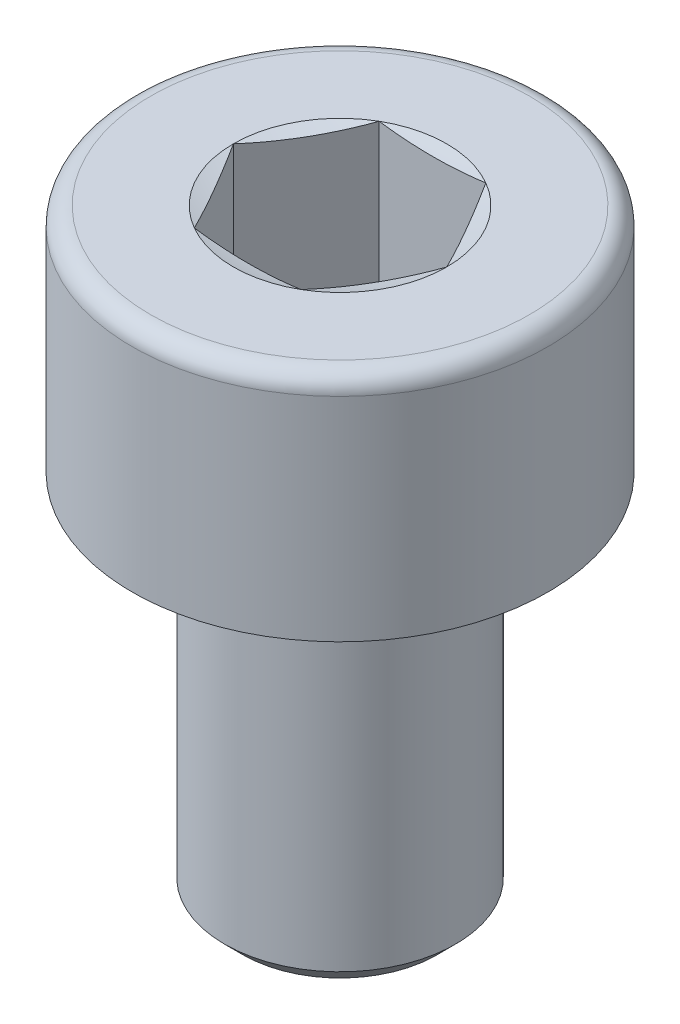
ISO-10303-21;
HEADER;
FILE_DESCRIPTION(('STEP AP214'),'2;1');
FILE_NAME('part.step','',(''),(''),'','','');
FILE_SCHEMA(('AUTOMOTIVE_DESIGN { 1 0 10303 214 1 1 1 1 }'));
ENDSEC;
DATA;
#1=APPLICATION_CONTEXT('core data for automotive mechanical design processes');
#2=APPLICATION_PROTOCOL_DEFINITION('international standard','automotive_design',2000,#1);
#3=PRODUCT_CONTEXT('',#1,'mechanical');
#4=PRODUCT('Part','Part','',(#3));
#5=PRODUCT_RELATED_PRODUCT_CATEGORY('part','',(#4));
#6=PRODUCT_DEFINITION_FORMATION('','',#4);
#7=PRODUCT_DEFINITION_CONTEXT('part definition',#1,'design');
#8=PRODUCT_DEFINITION('design','',#6,#7);
#9=PRODUCT_DEFINITION_SHAPE('','',#8);
#10=(LENGTH_UNIT() NAMED_UNIT(*) SI_UNIT(.MILLI.,.METRE.));
#11=(NAMED_UNIT(*) PLANE_ANGLE_UNIT() SI_UNIT($,.RADIAN.));
#12=(NAMED_UNIT(*) SI_UNIT($,.STERADIAN.) SOLID_ANGLE_UNIT());
#13=UNCERTAINTY_MEASURE_WITH_UNIT(LENGTH_MEASURE(1.E-05),#10,'distance_accuracy_value','');
#14=(GEOMETRIC_REPRESENTATION_CONTEXT(3) GLOBAL_UNCERTAINTY_ASSIGNED_CONTEXT((#13)) GLOBAL_UNIT_ASSIGNED_CONTEXT((#10,
#11,#12)) REPRESENTATION_CONTEXT('',''));
#15=CARTESIAN_POINT('',(0.,0.,0.));
#16=DIRECTION('',(0.,0.,1.));
#17=DIRECTION('',(1.,0.,0.));
#18=AXIS2_PLACEMENT_3D('',#15,#16,#17);
#19=CARTESIAN_POINT('',(-0.577350269189626,0.5,1.));
#20=DIRECTION('',(-0.866025403784439,0.,0.5));
#21=DIRECTION('',(0.5,0.,0.866025403784439));
#22=AXIS2_PLACEMENT_3D('',#19,#20,#21);
#23=PLANE('',#22);
#24=CARTESIAN_POINT('',(-0.577350269189626,2.5,1.));
#25=CARTESIAN_POINT('',(-0.602256905546369,2.4928156948734,0.956860440384478));
#26=CARTESIAN_POINT('',(-0.627233209396661,2.48665993251672,0.913600213130495));
#27=CARTESIAN_POINT('',(-0.677282869012062,2.47629629733561,0.826911659775093));
#28=CARTESIAN_POINT('',(-0.702356208114864,2.47208810385436,0.783483362533635));
#29=CARTESIAN_POINT('',(-0.777414647875531,2.46225168137474,0.653478331331313));
#30=CARTESIAN_POINT('',(-0.827492964204296,2.45934068378329,0.566740143092384));
#31=CARTESIAN_POINT('',(-0.923802752789168,2.46037348534467,0.399926695997169));
#32=CARTESIAN_POINT('',(-0.970035820593886,2.46381057241938,0.319848673569621));
#33=CARTESIAN_POINT('',(-1.03932177179707,2.47367744547349,0.199841885834972));
#34=CARTESIAN_POINT('',(-1.0624605054686,2.47776673103799,0.159764423493068));
#35=CARTESIAN_POINT('',(-1.10865304075022,2.48761182938245,0.0797566054548838));
#36=CARTESIAN_POINT('',(-1.13170682656885,2.49336793760975,0.0398262771102067));
#37=CARTESIAN_POINT('',(-1.15470053837925,2.5,0.));
#38=B_SPLINE_CURVE_WITH_KNOTS('',3,(#24,#25,#26,#27,#28,#29,#30,#31,#32,#33,#34,#35,#36,#37),
.UNSPECIFIED.,.F.,.F.,(4,2,2,2,2,2,4),(0.,0.150960283418929,0.3018957031821,0.602226966634645,
0.879613062899962,1.01895925678016,1.15833016516169),.UNSPECIFIED.);
#39=CARTESIAN_POINT('',(-0.577350269189627,2.5,0.999999999999998));
#40=VERTEX_POINT('',#39);
#41=CARTESIAN_POINT('',(-1.15470053837925,2.5,0.));
#42=VERTEX_POINT('',#41);
#43=EDGE_CURVE('E82',#40,#42,#38,.T.);
#44=ORIENTED_EDGE('',*,*,#43,.F.);
#45=DIRECTION('',(0.,1.,0.));
#46=VECTOR('',#45,1.);
#47=CARTESIAN_POINT('',(-0.577350269189626,0.5,1.));
#48=LINE('',#47,#46);
#49=CARTESIAN_POINT('',(-0.577350269189626,0.5,1.));
#50=VERTEX_POINT('',#49);
#51=EDGE_CURVE('E118',#40,#50,#48,.F.);
#52=ORIENTED_EDGE('',*,*,#51,.T.);
#53=DIRECTION('',(0.5,0.,0.866025403784439));
#54=VECTOR('',#53,1.);
#55=CARTESIAN_POINT('',(-0.577350269189626,0.5,1.));
#56=LINE('',#55,#54);
#57=CARTESIAN_POINT('',(-1.15470053837925,0.5,0.));
#58=VERTEX_POINT('',#57);
#59=EDGE_CURVE('E91',#58,#50,#56,.T.);
#60=ORIENTED_EDGE('',*,*,#59,.F.);
#61=DIRECTION('',(0.,1.,0.));
#62=VECTOR('',#61,1.);
#63=CARTESIAN_POINT('',(-1.15470053837925,0.5,0.));
#64=LINE('',#63,#62);
#65=EDGE_CURVE('E90',#58,#42,#64,.T.);
#66=ORIENTED_EDGE('',*,*,#65,.T.);
#67=EDGE_LOOP('',(#44,#52,#60,#66));
#68=FACE_BOUND('',#67,.T.);
#69=ADVANCED_FACE('F17',(#68),#23,.F.);
#70=CARTESIAN_POINT('',(-1.15470053837925,0.5,0.));
#71=DIRECTION('',(-0.866025403784439,0.,-0.5));
#72=DIRECTION('',(-0.5,0.,0.866025403784439));
#73=AXIS2_PLACEMENT_3D('',#70,#71,#72);
#74=PLANE('',#73);
#75=CARTESIAN_POINT('',(-1.15470053837925,2.5,0.));
#76=CARTESIAN_POINT('',(-1.12979390202251,2.4928156948734,-0.0431395596155219));
#77=CARTESIAN_POINT('',(-1.10481759817222,2.48665993251672,-0.086399786869505));
#78=CARTESIAN_POINT('',(-1.05476793855682,2.47629629733561,-0.173088340224907));
#79=CARTESIAN_POINT('',(-1.02969459945401,2.47208810385436,-0.216516637466365));
#80=CARTESIAN_POINT('',(-0.954636159693347,2.46225168137474,-0.346521668668687));
#81=CARTESIAN_POINT('',(-0.904557843364582,2.45934068378329,-0.433259856907615));
#82=CARTESIAN_POINT('',(-0.80824805477971,2.46037348534467,-0.600073304002831));
#83=CARTESIAN_POINT('',(-0.762014986974992,2.46381057241938,-0.680151326430379));
#84=CARTESIAN_POINT('',(-0.69272903577181,2.47367744547349,-0.800158114165028));
#85=CARTESIAN_POINT('',(-0.669590302100274,2.47776673103799,-0.840235576506932));
#86=CARTESIAN_POINT('',(-0.623397766818654,2.48761182938245,-0.920243394545117));
#87=CARTESIAN_POINT('',(-0.600343981000024,2.49336793760975,-0.960173722889794));
#88=CARTESIAN_POINT('',(-0.577350269189626,2.5,-1.));
#89=B_SPLINE_CURVE_WITH_KNOTS('',3,(#75,#76,#77,#78,#79,#80,#81,#82,#83,#84,#85,#86,#87,#88),
.UNSPECIFIED.,.F.,.F.,(4,2,2,2,2,2,4),(0.,0.150960283418929,0.3018957031821,0.602226966634645,
0.879613062899962,1.01895925678016,1.15833016516169),.UNSPECIFIED.);
#90=CARTESIAN_POINT('',(-0.577350269189623,2.5,-1.));
#91=VERTEX_POINT('',#90);
#92=EDGE_CURVE('E97',#42,#91,#89,.T.);
#93=ORIENTED_EDGE('',*,*,#92,.F.);
#94=ORIENTED_EDGE('',*,*,#65,.F.);
#95=DIRECTION('',(0.5,0.,-0.866025403784439));
#96=VECTOR('',#95,1.);
#97=CARTESIAN_POINT('',(-1.15470053837925,0.5,0.));
#98=LINE('',#97,#96);
#99=CARTESIAN_POINT('',(-0.577350269189626,0.5,-1.));
#100=VERTEX_POINT('',#99);
#101=EDGE_CURVE('E229',#58,#100,#98,.T.);
#102=ORIENTED_EDGE('',*,*,#101,.T.);
#103=DIRECTION('',(0.,1.,0.));
#104=VECTOR('',#103,1.);
#105=CARTESIAN_POINT('',(-0.577350269189626,0.5,-1.));
#106=LINE('',#105,#104);
#107=EDGE_CURVE('E116',#100,#91,#106,.T.);
#108=ORIENTED_EDGE('',*,*,#107,.T.);
#109=EDGE_LOOP('',(#93,#94,#102,#108));
#110=FACE_BOUND('',#109,.T.);
#111=ADVANCED_FACE('F114',(#110),#74,.F.);
#112=CARTESIAN_POINT('',(0.577350269189626,0.5,1.));
#113=DIRECTION('',(0.,0.,1.));
#114=DIRECTION('',(1.,0.,0.));
#115=AXIS2_PLACEMENT_3D('',#112,#113,#114);
#116=PLANE('',#115);
#117=CARTESIAN_POINT('',(0.577350269189626,2.5,0.999999999999999));
#118=CARTESIAN_POINT('',(0.527536996476139,2.4928156948734,1.));
#119=CARTESIAN_POINT('',(0.477584388775556,2.48665993251672,1.));
#120=CARTESIAN_POINT('',(0.377485069544755,2.47629629733561,1.));
#121=CARTESIAN_POINT('',(0.327338391339149,2.47208810385436,1.));
#122=CARTESIAN_POINT('',(0.177221511817816,2.46225168137474,1.));
#123=CARTESIAN_POINT('',(0.0770648791602852,2.45934068378329,1.));
#124=CARTESIAN_POINT('',(-0.115554698009459,2.46037348534467,1.));
#125=CARTESIAN_POINT('',(-0.208020833618895,2.46381057241938,1.));
#126=CARTESIAN_POINT('',(-0.346592736025259,2.47367744547349,1.));
#127=CARTESIAN_POINT('',(-0.392870203368329,2.47776673103799,1.));
#128=CARTESIAN_POINT('',(-0.48525527393157,2.48761182938245,1.));
#129=CARTESIAN_POINT('',(-0.531362845568829,2.49336793760975,1.));
#130=CARTESIAN_POINT('',(-0.577350269189626,2.5,1.));
#131=B_SPLINE_CURVE_WITH_KNOTS('',3,(#117,#118,#119,#120,#121,#122,#123,#124,#125,#126,#127,
#128,#129,#130),.UNSPECIFIED.,.F.,.F.,(4,2,2,2,2,2,4),(0.,0.150960283418929,0.3018957031821,
0.602226966634646,0.879613062899963,1.01895925678016,1.15833016516169),.UNSPECIFIED.);
#132=CARTESIAN_POINT('',(0.577350269189623,2.5,1.));
#133=VERTEX_POINT('',#132);
#134=EDGE_CURVE('E76',#133,#40,#131,.T.);
#135=ORIENTED_EDGE('',*,*,#134,.F.);
#136=DIRECTION('',(0.,1.,0.));
#137=VECTOR('',#136,1.);
#138=CARTESIAN_POINT('',(0.577350269189626,0.5,1.));
#139=LINE('',#138,#137);
#140=CARTESIAN_POINT('',(0.577350269189626,0.5,1.));
#141=VERTEX_POINT('',#140);
#142=EDGE_CURVE('E212',#133,#141,#139,.F.);
#143=ORIENTED_EDGE('',*,*,#142,.T.);
#144=DIRECTION('',(1.,0.,0.));
#145=VECTOR('',#144,1.);
#146=CARTESIAN_POINT('',(-0.577350269189626,0.5,1.));
#147=LINE('',#146,#145);
#148=EDGE_CURVE('E233',#141,#50,#147,.F.);
#149=ORIENTED_EDGE('',*,*,#148,.T.);
#150=ORIENTED_EDGE('',*,*,#51,.F.);
#151=EDGE_LOOP('',(#135,#143,#149,#150));
#152=FACE_BOUND('',#151,.T.);
#153=ADVANCED_FACE('F139',(#152),#116,.F.);
#154=CARTESIAN_POINT('',(-0.577350269189626,0.5,-1.));
#155=DIRECTION('',(0.,-1.,0.));
#156=DIRECTION('',(0.,0.,-1.));
#157=AXIS2_PLACEMENT_3D('',#154,#155,#156);
#158=PLANE('',#157);
#159=ORIENTED_EDGE('',*,*,#59,.T.);
#160=ORIENTED_EDGE('',*,*,#148,.F.);
#161=DIRECTION('',(0.5,0.,-0.866025403784438));
#162=VECTOR('',#161,1.);
#163=CARTESIAN_POINT('',(1.15470053837925,0.5,0.));
#164=LINE('',#163,#162);
#165=CARTESIAN_POINT('',(1.15470053837925,0.5,0.));
#166=VERTEX_POINT('',#165);
#167=EDGE_CURVE('E161',#141,#166,#164,.T.);
#168=ORIENTED_EDGE('',*,*,#167,.T.);
#169=DIRECTION('',(-0.5,0.,-0.866025403784439));
#170=VECTOR('',#169,1.);
#171=CARTESIAN_POINT('',(0.577350269189626,0.5,-1.));
#172=LINE('',#171,#170);
#173=CARTESIAN_POINT('',(0.577350269189626,0.5,-1.));
#174=VERTEX_POINT('',#173);
#175=EDGE_CURVE('E209',#166,#174,#172,.T.);
#176=ORIENTED_EDGE('',*,*,#175,.T.);
#177=DIRECTION('',(-1.,0.,0.));
#178=VECTOR('',#177,1.);
#179=CARTESIAN_POINT('',(-0.577350269189626,0.5,-1.));
#180=LINE('',#179,#178);
#181=EDGE_CURVE('E224',#174,#100,#180,.T.);
#182=ORIENTED_EDGE('',*,*,#181,.T.);
#183=ORIENTED_EDGE('',*,*,#101,.F.);
#184=EDGE_LOOP('',(#159,#160,#168,#176,#182,#183));
#185=FACE_BOUND('',#184,.T.);
#186=ADVANCED_FACE('F143',(#185),#158,.F.);
#187=CARTESIAN_POINT('',(-0.577350269189626,0.5,-1.));
#188=DIRECTION('',(0.,0.,-1.));
#189=DIRECTION('',(-1.,0.,0.));
#190=AXIS2_PLACEMENT_3D('',#187,#188,#189);
#191=PLANE('',#190);
#192=CARTESIAN_POINT('',(-0.577350269189626,2.5,-1.));
#193=CARTESIAN_POINT('',(-0.527536996476139,2.4928156948734,-1.));
#194=CARTESIAN_POINT('',(-0.477584388775556,2.48665993251672,-1.));
#195=CARTESIAN_POINT('',(-0.377485069544755,2.47629629733561,-1.));
#196=CARTESIAN_POINT('',(-0.327338391339149,2.47208810385436,-1.));
#197=CARTESIAN_POINT('',(-0.177221511817816,2.46225168137474,-1.));
#198=CARTESIAN_POINT('',(-0.077064879160285,2.45934068378329,-1.));
#199=CARTESIAN_POINT('',(0.11555469800946,2.46037348534467,-1.));
#200=CARTESIAN_POINT('',(0.208020833618896,2.46381057241938,-1.));
#201=CARTESIAN_POINT('',(0.34659273602526,2.47367744547349,-1.));
#202=CARTESIAN_POINT('',(0.39287020336833,2.47776673103799,-1.));
#203=CARTESIAN_POINT('',(0.485255273931571,2.48761182938245,-1.));
#204=CARTESIAN_POINT('',(0.53136284556883,2.49336793760975,-1.));
#205=CARTESIAN_POINT('',(0.577350269189627,2.5,-0.999999999999999));
#206=B_SPLINE_CURVE_WITH_KNOTS('',3,(#192,#193,#194,#195,#196,#197,#198,#199,#200,#201,#202,
#203,#204,#205),.UNSPECIFIED.,.F.,.F.,(4,2,2,2,2,2,4),(0.,0.150960283418929,0.3018957031821,
0.602226966634646,0.879613062899963,1.01895925678016,1.15833016516169),.UNSPECIFIED.);
#207=CARTESIAN_POINT('',(0.577350269189626,2.5,-0.999999999999999));
#208=VERTEX_POINT('',#207);
#209=EDGE_CURVE('E156',#91,#208,#206,.T.);
#210=ORIENTED_EDGE('',*,*,#209,.F.);
#211=ORIENTED_EDGE('',*,*,#107,.F.);
#212=ORIENTED_EDGE('',*,*,#181,.F.);
#213=DIRECTION('',(0.,1.,0.));
#214=VECTOR('',#213,1.);
#215=CARTESIAN_POINT('',(0.577350269189626,0.5,-1.));
#216=LINE('',#215,#214);
#217=EDGE_CURVE('E204',#174,#208,#216,.T.);
#218=ORIENTED_EDGE('',*,*,#217,.T.);
#219=EDGE_LOOP('',(#210,#211,#212,#218));
#220=FACE_BOUND('',#219,.T.);
#221=ADVANCED_FACE('F147',(#220),#191,.F.);
#222=CARTESIAN_POINT('',(1.15470053837925,0.5,0.));
#223=DIRECTION('',(0.866025403784438,0.,0.5));
#224=DIRECTION('',(0.5,0.,-0.866025403784438));
#225=AXIS2_PLACEMENT_3D('',#222,#223,#224);
#226=PLANE('',#225);
#227=CARTESIAN_POINT('',(1.15470053837925,2.5,0.));
#228=CARTESIAN_POINT('',(1.12979390202251,2.4928156948734,0.0431395596155222));
#229=CARTESIAN_POINT('',(1.10481759817222,2.48665993251672,0.0863997868695053));
#230=CARTESIAN_POINT('',(1.05476793855682,2.47629629733561,0.173088340224907));
#231=CARTESIAN_POINT('',(1.02969459945401,2.47208810385436,0.216516637466365));
#232=CARTESIAN_POINT('',(0.954636159693347,2.46225168137474,0.346521668668687));
#233=CARTESIAN_POINT('',(0.904557843364581,2.45934068378329,0.433259856907615));
#234=CARTESIAN_POINT('',(0.808248054779709,2.46037348534467,0.600073304002831));
#235=CARTESIAN_POINT('',(0.762014986974991,2.46381057241938,0.680151326430379));
#236=CARTESIAN_POINT('',(0.692729035771809,2.47367744547349,0.800158114165028));
#237=CARTESIAN_POINT('',(0.669590302100274,2.47776673103799,0.840235576506932));
#238=CARTESIAN_POINT('',(0.623397766818654,2.48761182938245,0.920243394545116));
#239=CARTESIAN_POINT('',(0.600343981000025,2.49336793760975,0.960173722889793));
#240=CARTESIAN_POINT('',(0.577350269189626,2.5,0.999999999999999));
#241=B_SPLINE_CURVE_WITH_KNOTS('',3,(#227,#228,#229,#230,#231,#232,#233,#234,#235,#236,#237,
#238,#239,#240),.UNSPECIFIED.,.F.,.F.,(4,2,2,2,2,2,4),(0.,0.150960283418929,0.3018957031821,
0.602226966634646,0.879613062899962,1.01895925678016,1.15833016516169),.UNSPECIFIED.);
#242=CARTESIAN_POINT('',(1.15470053837925,2.5,0.));
#243=VERTEX_POINT('',#242);
#244=EDGE_CURVE('E162',#243,#133,#241,.T.);
#245=ORIENTED_EDGE('',*,*,#244,.F.);
#246=DIRECTION('',(0.,1.,0.));
#247=VECTOR('',#246,1.);
#248=CARTESIAN_POINT('',(1.15470053837925,0.5,0.));
#249=LINE('',#248,#247);
#250=EDGE_CURVE('E200',#243,#166,#249,.F.);
#251=ORIENTED_EDGE('',*,*,#250,.T.);
#252=ORIENTED_EDGE('',*,*,#167,.F.);
#253=ORIENTED_EDGE('',*,*,#142,.F.);
#254=EDGE_LOOP('',(#245,#251,#252,#253));
#255=FACE_BOUND('',#254,.T.);
#256=ADVANCED_FACE('F152',(#255),#226,.F.);
#257=CARTESIAN_POINT('',(0.577350269189626,0.5,-1.));
#258=DIRECTION('',(0.866025403784439,0.,-0.5));
#259=DIRECTION('',(-0.5,0.,-0.866025403784439));
#260=AXIS2_PLACEMENT_3D('',#257,#258,#259);
#261=PLANE('',#260);
#262=CARTESIAN_POINT('',(1.15470053837925,2.5,0.));
#263=CARTESIAN_POINT('',(1.12979390202251,2.4928156948734,-0.0431395596155219));
#264=CARTESIAN_POINT('',(1.10481759817222,2.48665993251672,-0.0863997868695049));
#265=CARTESIAN_POINT('',(1.05476793855682,2.47629629733561,-0.173088340224907));
#266=CARTESIAN_POINT('',(1.02969459945401,2.47208810385436,-0.216516637466365));
#267=CARTESIAN_POINT('',(0.954636159693347,2.46225168137474,-0.346521668668687));
#268=CARTESIAN_POINT('',(0.904557843364582,2.45934068378329,-0.433259856907615));
#269=CARTESIAN_POINT('',(0.80824805477971,2.46037348534467,-0.600073304002831));
#270=CARTESIAN_POINT('',(0.762014986974991,2.46381057241938,-0.680151326430379));
#271=CARTESIAN_POINT('',(0.69272903577181,2.47367744547349,-0.800158114165028));
#272=CARTESIAN_POINT('',(0.669590302100275,2.47776673103799,-0.840235576506931));
#273=CARTESIAN_POINT('',(0.623397766818654,2.48761182938245,-0.920243394545116));
#274=CARTESIAN_POINT('',(0.600343981000025,2.49336793760975,-0.960173722889793));
#275=CARTESIAN_POINT('',(0.577350269189627,2.5,-0.999999999999999));
#276=B_SPLINE_CURVE_WITH_KNOTS('',3,(#262,#263,#264,#265,#266,#267,#268,#269,#270,#271,#272,
#273,#274,#275),.UNSPECIFIED.,.F.,.F.,(4,2,2,2,2,2,4),(0.,0.150960283418929,0.3018957031821,
0.602226966634645,0.879613062899962,1.01895925678016,1.15833016516169),.UNSPECIFIED.);
#277=EDGE_CURVE('E203',#243,#208,#276,.T.);
#278=ORIENTED_EDGE('',*,*,#277,.T.);
#279=ORIENTED_EDGE('',*,*,#217,.F.);
#280=ORIENTED_EDGE('',*,*,#175,.F.);
#281=ORIENTED_EDGE('',*,*,#250,.F.);
#282=EDGE_LOOP('',(#278,#279,#280,#281));
#283=FACE_BOUND('',#282,.T.);
#284=ADVANCED_FACE('F266',(#283),#261,.F.);
#285=CARTESIAN_POINT('',(0.,-4.,0.));
#286=DIRECTION('',(0.,-1.,0.));
#287=DIRECTION('',(0.,0.,-1.));
#288=AXIS2_PLACEMENT_3D('',#285,#286,#287);
#289=PLANE('',#288);
#290=CARTESIAN_POINT('',(0.,-3.99999999996226,0.));
#291=DIRECTION('',(0.,1.,0.));
#292=DIRECTION('',(0.,0.,1.));
#293=AXIS2_PLACEMENT_3D('',#290,#291,#292);
#294=CIRCLE('',#293,1.05000000002065);
#295=CARTESIAN_POINT('',(0.,-3.99999999996226,1.05000000002065));
#296=VERTEX_POINT('',#295);
#297=EDGE_CURVE('E260',#296,#296,#294,.T.);
#298=ORIENTED_EDGE('',*,*,#297,.F.);
#299=EDGE_LOOP('',(#298));
#300=FACE_BOUND('',#299,.T.);
#301=ADVANCED_FACE('F196',(#300),#289,.T.);
#302=CARTESIAN_POINT('',(-0.323386652483568,5.38251924939228,0.));
#303=DIRECTION('',(0.,0.,1.));
#304=DIRECTION('',(-1.,0.,0.));
#305=AXIS2_PLACEMENT_3D('',#302,#303,#304);
#306=CIRCLE('',#305,3.);
#307=TRIMMED_CURVE('',#306,(PARAMETER_VALUE(-1.67880173874616)),
(PARAMETER_VALUE(1.67880173874616)),.T.,.PARAMETER.);
#308=CARTESIAN_POINT('',(0.,5.38251924939228,0.));
#309=DIRECTION('',(0.,1.,0.));
#310=AXIS1_PLACEMENT('',#308,#309);
#311=SURFACE_OF_REVOLUTION('',#307,#310);
#312=ORIENTED_EDGE('',*,*,#244,.T.);
#313=CARTESIAN_POINT('',(0.,2.5,0.));
#314=DIRECTION('',(0.,1.,0.));
#315=DIRECTION('',(-1.,0.,0.));
#316=AXIS2_PLACEMENT_3D('',#313,#314,#315);
#317=CIRCLE('',#316,1.15470053837925);
#318=EDGE_CURVE('E258',#243,#133,#317,.F.);
#319=ORIENTED_EDGE('',*,*,#318,.F.);
#320=EDGE_LOOP('',(#312,#319));
#321=FACE_BOUND('',#320,.T.);
#322=ADVANCED_FACE('F192',(#321),#311,.T.);
#323=CARTESIAN_POINT('',(-0.323386652483568,5.38251924939228,0.));
#324=DIRECTION('',(0.,0.,1.));
#325=DIRECTION('',(-1.,0.,0.));
#326=AXIS2_PLACEMENT_3D('',#323,#324,#325);
#327=CIRCLE('',#326,3.);
#328=TRIMMED_CURVE('',#327,(PARAMETER_VALUE(-1.67880173874616)),
(PARAMETER_VALUE(1.67880173874616)),.T.,.PARAMETER.);
#329=CARTESIAN_POINT('',(0.,5.38251924939228,0.));
#330=DIRECTION('',(0.,1.,0.));
#331=AXIS1_PLACEMENT('',#329,#330);
#332=SURFACE_OF_REVOLUTION('',#328,#331);
#333=ORIENTED_EDGE('',*,*,#134,.T.);
#334=CARTESIAN_POINT('',(0.,2.5,0.));
#335=DIRECTION('',(0.,1.,0.));
#336=DIRECTION('',(-1.,0.,0.));
#337=AXIS2_PLACEMENT_3D('',#334,#335,#336);
#338=CIRCLE('',#337,1.15470053837925);
#339=EDGE_CURVE('E107',#133,#40,#338,.F.);
#340=ORIENTED_EDGE('',*,*,#339,.F.);
#341=EDGE_LOOP('',(#333,#340));
#342=FACE_BOUND('',#341,.T.);
#343=ADVANCED_FACE('F189',(#342),#332,.T.);
#344=CARTESIAN_POINT('',(-0.323386652483568,5.38251924939228,0.));
#345=DIRECTION('',(0.,0.,1.));
#346=DIRECTION('',(-1.,0.,0.));
#347=AXIS2_PLACEMENT_3D('',#344,#345,#346);
#348=CIRCLE('',#347,3.);
#349=TRIMMED_CURVE('',#348,(PARAMETER_VALUE(-1.67880173874616)),
(PARAMETER_VALUE(1.67880173874616)),.T.,.PARAMETER.);
#350=CARTESIAN_POINT('',(0.,5.38251924939228,0.));
#351=DIRECTION('',(0.,1.,0.));
#352=AXIS1_PLACEMENT('',#350,#351);
#353=SURFACE_OF_REVOLUTION('',#349,#352);
#354=ORIENTED_EDGE('',*,*,#43,.T.);
#355=CARTESIAN_POINT('',(0.,2.5,0.));
#356=DIRECTION('',(0.,1.,0.));
#357=DIRECTION('',(-1.,0.,0.));
#358=AXIS2_PLACEMENT_3D('',#355,#356,#357);
#359=CIRCLE('',#358,1.15470053837925);
#360=EDGE_CURVE('E86',#40,#42,#359,.F.);
#361=ORIENTED_EDGE('',*,*,#360,.F.);
#362=EDGE_LOOP('',(#354,#361));
#363=FACE_BOUND('',#362,.T.);
#364=ADVANCED_FACE('F84',(#363),#353,.T.);
#365=CARTESIAN_POINT('',(-0.323386652483568,5.38251924939228,0.));
#366=DIRECTION('',(0.,0.,1.));
#367=DIRECTION('',(-1.,0.,0.));
#368=AXIS2_PLACEMENT_3D('',#365,#366,#367);
#369=CIRCLE('',#368,3.);
#370=TRIMMED_CURVE('',#369,(PARAMETER_VALUE(-1.67880173874616)),
(PARAMETER_VALUE(1.67880173874616)),.T.,.PARAMETER.);
#371=CARTESIAN_POINT('',(0.,5.38251924939228,0.));
#372=DIRECTION('',(0.,1.,0.));
#373=AXIS1_PLACEMENT('',#371,#372);
#374=SURFACE_OF_REVOLUTION('',#370,#373);
#375=ORIENTED_EDGE('',*,*,#92,.T.);
#376=CARTESIAN_POINT('',(0.,2.5,0.));
#377=DIRECTION('',(0.,1.,0.));
#378=DIRECTION('',(-1.,0.,0.));
#379=AXIS2_PLACEMENT_3D('',#376,#377,#378);
#380=CIRCLE('',#379,1.15470053837925);
#381=EDGE_CURVE('E104',#42,#91,#380,.F.);
#382=ORIENTED_EDGE('',*,*,#381,.F.);
#383=EDGE_LOOP('',(#375,#382));
#384=FACE_BOUND('',#383,.T.);
#385=ADVANCED_FACE('F110',(#384),#374,.T.);
#386=CARTESIAN_POINT('',(-0.323386652483568,5.38251924939228,0.));
#387=DIRECTION('',(0.,0.,1.));
#388=DIRECTION('',(-1.,0.,0.));
#389=AXIS2_PLACEMENT_3D('',#386,#387,#388);
#390=CIRCLE('',#389,3.);
#391=TRIMMED_CURVE('',#390,(PARAMETER_VALUE(-1.67880173874616)),
(PARAMETER_VALUE(1.67880173874616)),.T.,.PARAMETER.);
#392=CARTESIAN_POINT('',(0.,5.38251924939228,0.));
#393=DIRECTION('',(0.,1.,0.));
#394=AXIS1_PLACEMENT('',#392,#393);
#395=SURFACE_OF_REVOLUTION('',#391,#394);
#396=ORIENTED_EDGE('',*,*,#209,.T.);
#397=CARTESIAN_POINT('',(0.,2.5,0.));
#398=DIRECTION('',(0.,1.,0.));
#399=DIRECTION('',(-1.,0.,0.));
#400=AXIS2_PLACEMENT_3D('',#397,#398,#399);
#401=CIRCLE('',#400,1.15470053837925);
#402=EDGE_CURVE('E112',#91,#208,#401,.F.);
#403=ORIENTED_EDGE('',*,*,#402,.F.);
#404=EDGE_LOOP('',(#396,#403));
#405=FACE_BOUND('',#404,.T.);
#406=ADVANCED_FACE('F168',(#405),#395,.T.);
#407=CARTESIAN_POINT('',(-0.323386652483568,5.38251924939228,0.));
#408=DIRECTION('',(0.,0.,1.));
#409=DIRECTION('',(-1.,0.,0.));
#410=AXIS2_PLACEMENT_3D('',#407,#408,#409);
#411=CIRCLE('',#410,3.);
#412=TRIMMED_CURVE('',#411,(PARAMETER_VALUE(-1.67880173874616)),
(PARAMETER_VALUE(1.67880173874616)),.T.,.PARAMETER.);
#413=CARTESIAN_POINT('',(0.,5.38251924939228,0.));
#414=DIRECTION('',(0.,1.,0.));
#415=AXIS1_PLACEMENT('',#413,#414);
#416=SURFACE_OF_REVOLUTION('',#412,#415);
#417=ORIENTED_EDGE('',*,*,#277,.F.);
#418=CARTESIAN_POINT('',(0.,2.5,0.));
#419=DIRECTION('',(0.,1.,0.));
#420=DIRECTION('',(-1.,0.,0.));
#421=AXIS2_PLACEMENT_3D('',#418,#419,#420);
#422=CIRCLE('',#421,1.15470053837925);
#423=EDGE_CURVE('E252',#208,#243,#422,.F.);
#424=ORIENTED_EDGE('',*,*,#423,.F.);
#425=EDGE_LOOP('',(#417,#424));
#426=FACE_BOUND('',#425,.T.);
#427=ADVANCED_FACE('F173',(#426),#416,.T.);
#428=CARTESIAN_POINT('',(0.,-3.79999999995562,0.));
#429=DIRECTION('',(0.,1.,0.));
#430=DIRECTION('',(0.,0.,1.));
#431=AXIS2_PLACEMENT_3D('',#428,#429,#430);
#432=CONICAL_SURFACE('',#431,1.25000000002728,0.785398163397448);
#433=ORIENTED_EDGE('',*,*,#297,.T.);
#434=EDGE_LOOP('',(#433));
#435=FACE_BOUND('',#434,.T.);
#436=CARTESIAN_POINT('',(0.,-3.8,0.));
#437=DIRECTION('',(0.,1.,0.));
#438=DIRECTION('',(0.,0.,1.));
#439=AXIS2_PLACEMENT_3D('',#436,#437,#438);
#440=CIRCLE('',#439,1.25);
#441=CARTESIAN_POINT('',(0.,-3.8,1.25));
#442=VERTEX_POINT('',#441);
#443=EDGE_CURVE('E255',#442,#442,#440,.T.);
#444=ORIENTED_EDGE('',*,*,#443,.F.);
#445=EDGE_LOOP('',(#444));
#446=FACE_BOUND('',#445,.T.);
#447=ADVANCED_FACE('F312',(#435,#446),#432,.T.);
#448=CARTESIAN_POINT('',(0.,2.5,0.));
#449=DIRECTION('',(0.,1.,0.));
#450=DIRECTION('',(0.,0.,1.));
#451=AXIS2_PLACEMENT_3D('',#448,#449,#450);
#452=PLANE('',#451);
#453=CARTESIAN_POINT('',(0.,2.5,0.));
#454=DIRECTION('',(0.,-1.,0.));
#455=DIRECTION('',(0.,0.,-1.));
#456=AXIS2_PLACEMENT_3D('',#453,#454,#455);
#457=CIRCLE('',#456,2.05);
#458=CARTESIAN_POINT('',(0.,2.5,-2.05));
#459=VERTEX_POINT('',#458);
#460=CARTESIAN_POINT('',(0.,2.5,2.05));
#461=VERTEX_POINT('',#460);
#462=EDGE_CURVE('E251',#459,#461,#457,.T.);
#463=ORIENTED_EDGE('',*,*,#462,.F.);
#464=CARTESIAN_POINT('',(0.,2.5,0.));
#465=DIRECTION('',(0.,-1.,0.));
#466=DIRECTION('',(0.,0.,1.));
#467=AXIS2_PLACEMENT_3D('',#464,#465,#466);
#468=CIRCLE('',#467,2.05);
#469=EDGE_CURVE('E37',#461,#459,#468,.T.);
#470=ORIENTED_EDGE('',*,*,#469,.F.);
#471=EDGE_LOOP('',(#463,#470));
#472=FACE_BOUND('',#471,.T.);
#473=ORIENTED_EDGE('',*,*,#402,.T.);
#474=ORIENTED_EDGE('',*,*,#423,.T.);
#475=ORIENTED_EDGE('',*,*,#318,.T.);
#476=ORIENTED_EDGE('',*,*,#339,.T.);
#477=ORIENTED_EDGE('',*,*,#360,.T.);
#478=ORIENTED_EDGE('',*,*,#381,.T.);
#479=EDGE_LOOP('',(#473,#474,#475,#476,#477,#478));
#480=FACE_BOUND('',#479,.T.);
#481=ADVANCED_FACE('F103',(#472,#480),#452,.T.);
#482=CARTESIAN_POINT('',(0.,-4.,0.));
#483=DIRECTION('',(0.,1.,0.));
#484=DIRECTION('',(0.,0.,1.));
#485=AXIS2_PLACEMENT_3D('',#482,#483,#484);
#486=CYLINDRICAL_SURFACE('',#485,1.25);
#487=ORIENTED_EDGE('',*,*,#443,.T.);
#488=EDGE_LOOP('',(#487));
#489=FACE_BOUND('',#488,.T.);
#490=CARTESIAN_POINT('',(0.,0.,0.));
#491=DIRECTION('',(0.,1.,0.));
#492=DIRECTION('',(0.,0.,1.));
#493=AXIS2_PLACEMENT_3D('',#490,#491,#492);
#494=CIRCLE('',#493,1.25);
#495=CARTESIAN_POINT('',(0.,0.,1.25));
#496=VERTEX_POINT('',#495);
#497=EDGE_CURVE('E248',#496,#496,#494,.F.);
#498=ORIENTED_EDGE('',*,*,#497,.T.);
#499=EDGE_LOOP('',(#498));
#500=FACE_BOUND('',#499,.T.);
#501=ADVANCED_FACE('F293',(#489,#500),#486,.T.);
#502=CARTESIAN_POINT('',(0.,2.3,0.));
#503=DIRECTION('',(0.,1.,0.));
#504=DIRECTION('',(0.,0.,1.));
#505=AXIS2_PLACEMENT_3D('',#502,#503,#504);
#506=TOROIDAL_SURFACE('',#505,2.05,0.2);
#507=ORIENTED_EDGE('',*,*,#469,.T.);
#508=ORIENTED_EDGE('',*,*,#462,.T.);
#509=EDGE_LOOP('',(#507,#508));
#510=FACE_BOUND('',#509,.T.);
#511=CARTESIAN_POINT('',(0.,2.3,0.));
#512=DIRECTION('',(0.,-1.,0.));
#513=DIRECTION('',(0.,0.,-1.));
#514=AXIS2_PLACEMENT_3D('',#511,#512,#513);
#515=CIRCLE('',#514,2.25);
#516=CARTESIAN_POINT('',(0.,2.3,-2.25));
#517=VERTEX_POINT('',#516);
#518=EDGE_CURVE('E29',#517,#517,#515,.T.);
#519=ORIENTED_EDGE('',*,*,#518,.F.);
#520=EDGE_LOOP('',(#519));
#521=FACE_BOUND('',#520,.T.);
#522=ADVANCED_FACE('F285',(#510,#521),#506,.T.);
#523=CARTESIAN_POINT('',(0.,0.,0.));
#524=DIRECTION('',(0.,1.,0.));
#525=DIRECTION('',(0.,0.,1.));
#526=AXIS2_PLACEMENT_3D('',#523,#524,#525);
#527=PLANE('',#526);
#528=ORIENTED_EDGE('',*,*,#497,.F.);
#529=EDGE_LOOP('',(#528));
#530=FACE_BOUND('',#529,.T.);
#531=CARTESIAN_POINT('',(0.,0.,0.));
#532=DIRECTION('',(0.,-1.,0.));
#533=DIRECTION('',(0.,0.,-1.));
#534=AXIS2_PLACEMENT_3D('',#531,#532,#533);
#535=CIRCLE('',#534,2.25);
#536=CARTESIAN_POINT('',(0.,0.,-2.25));
#537=VERTEX_POINT('',#536);
#538=EDGE_CURVE('E11',#537,#537,#535,.F.);
#539=ORIENTED_EDGE('',*,*,#538,.F.);
#540=EDGE_LOOP('',(#539));
#541=FACE_BOUND('',#540,.T.);
#542=ADVANCED_FACE('F279',(#530,#541),#527,.F.);
#543=CARTESIAN_POINT('',(0.,2.5,0.));
#544=DIRECTION('',(0.,-1.,0.));
#545=DIRECTION('',(0.,0.,-1.));
#546=AXIS2_PLACEMENT_3D('',#543,#544,#545);
#547=CYLINDRICAL_SURFACE('',#546,2.25);
#548=ORIENTED_EDGE('',*,*,#538,.T.);
#549=EDGE_LOOP('',(#548));
#550=FACE_BOUND('',#549,.T.);
#551=ORIENTED_EDGE('',*,*,#518,.T.);
#552=EDGE_LOOP('',(#551));
#553=FACE_BOUND('',#552,.T.);
#554=ADVANCED_FACE('F277',(#550,#553),#547,.T.);
#555=CLOSED_SHELL('',(#69,#111,#153,#186,#221,#256,#284,#301,#322,#343,#364,#385,#406,#427,#447,
#481,#501,#522,#542,#554));
#556=MANIFOLD_SOLID_BREP('B1',#555);
#557=ADVANCED_BREP_SHAPE_REPRESENTATION('',(#18,#556),#14);
#558=SHAPE_DEFINITION_REPRESENTATION(#9,#557);
ENDSEC;
END-ISO-10303-21;
